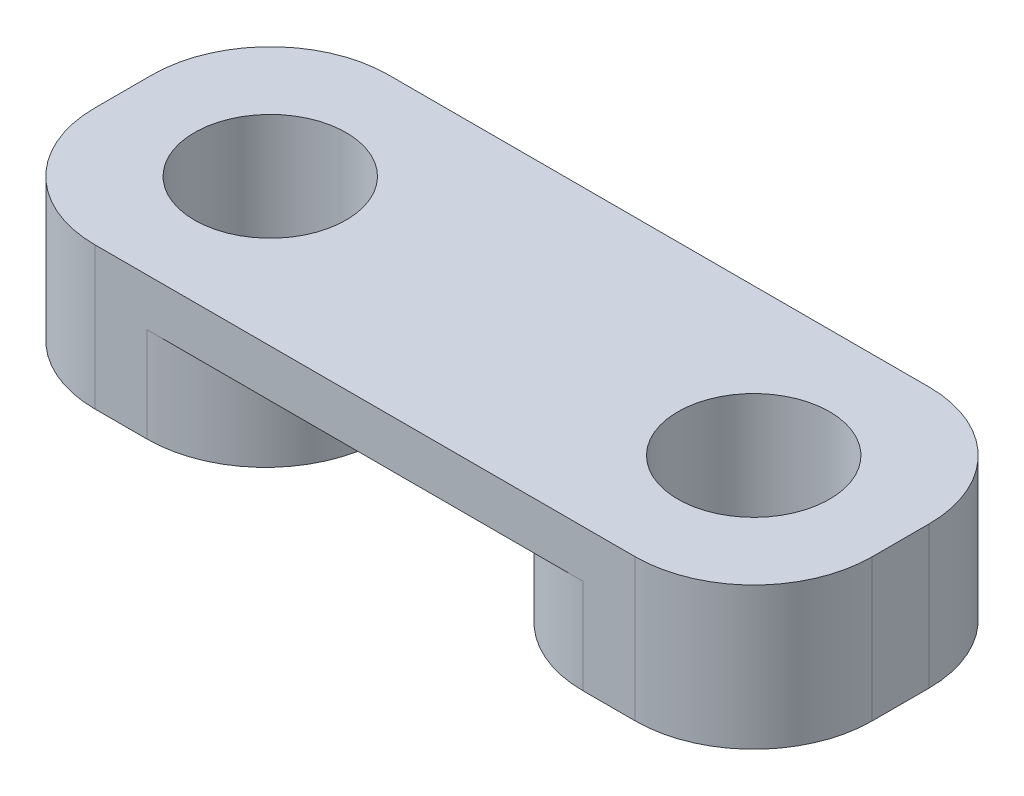
ISO-10303-21;
HEADER;
FILE_DESCRIPTION(('STEP AP214'),'2;1');
FILE_NAME('part.step','',(''),(''),'','','');
FILE_SCHEMA(('AUTOMOTIVE_DESIGN { 1 0 10303 214 1 1 1 1 }'));
ENDSEC;
DATA;
#1=APPLICATION_CONTEXT('core data for automotive mechanical design processes');
#2=APPLICATION_PROTOCOL_DEFINITION('international standard','automotive_design',2000,#1);
#3=PRODUCT_CONTEXT('',#1,'mechanical');
#4=PRODUCT('Part','Part','',(#3));
#5=PRODUCT_RELATED_PRODUCT_CATEGORY('part','',(#4));
#6=PRODUCT_DEFINITION_FORMATION('','',#4);
#7=PRODUCT_DEFINITION_CONTEXT('part definition',#1,'design');
#8=PRODUCT_DEFINITION('design','',#6,#7);
#9=PRODUCT_DEFINITION_SHAPE('','',#8);
#10=(LENGTH_UNIT() NAMED_UNIT(*) SI_UNIT(.MILLI.,.METRE.));
#11=(NAMED_UNIT(*) PLANE_ANGLE_UNIT() SI_UNIT($,.RADIAN.));
#12=(NAMED_UNIT(*) SI_UNIT($,.STERADIAN.) SOLID_ANGLE_UNIT());
#13=UNCERTAINTY_MEASURE_WITH_UNIT(LENGTH_MEASURE(1.E-05),#10,'distance_accuracy_value','');
#14=(GEOMETRIC_REPRESENTATION_CONTEXT(3) GLOBAL_UNCERTAINTY_ASSIGNED_CONTEXT((#13)) GLOBAL_UNIT_ASSIGNED_CONTEXT((#10,
#11,#12)) REPRESENTATION_CONTEXT('',''));
#15=CARTESIAN_POINT('',(0.,0.,0.));
#16=DIRECTION('',(0.,0.,1.));
#17=DIRECTION('',(1.,0.,0.));
#18=AXIS2_PLACEMENT_3D('',#15,#16,#17);
#19=CARTESIAN_POINT('',(0.,0.,0.));
#20=DIRECTION('',(0.,1.,0.));
#21=DIRECTION('',(0.,0.,1.));
#22=AXIS2_PLACEMENT_3D('',#19,#20,#21);
#23=PLANE('',#22);
#24=CARTESIAN_POINT('',(-5.0990195,0.,-3.1));
#25=DIRECTION('',(0.,1.,0.));
#26=DIRECTION('',(0.,0.,1.));
#27=AXIS2_PLACEMENT_3D('',#24,#25,#26);
#28=CIRCLE('',#27,1.6);
#29=CARTESIAN_POINT('',(-5.0990195,0.,-1.5));
#30=VERTEX_POINT('',#29);
#31=EDGE_CURVE('E284',#30,#30,#28,.T.);
#32=ORIENTED_EDGE('',*,*,#31,.T.);
#33=EDGE_LOOP('',(#32));
#34=FACE_BOUND('',#33,.T.);
#35=DIRECTION('',(-1.,0.,0.));
#36=VECTOR('',#35,1.);
#37=CARTESIAN_POINT('',(8.1990195,0.,-6.2));
#38=LINE('',#37,#36);
#39=CARTESIAN_POINT('',(-4.5990195,0.,-6.2));
#40=VERTEX_POINT('',#39);
#41=CARTESIAN_POINT('',(-5.6990195,0.,-6.2));
#42=VERTEX_POINT('',#41);
#43=EDGE_CURVE('E187',#40,#42,#38,.T.);
#44=ORIENTED_EDGE('',*,*,#43,.F.);
#45=CARTESIAN_POINT('',(-4.5990195,0.,-3.7));
#46=DIRECTION('',(0.,1.,0.));
#47=DIRECTION('',(0.,0.,1.));
#48=AXIS2_PLACEMENT_3D('',#45,#46,#47);
#49=CIRCLE('',#48,2.5);
#50=CARTESIAN_POINT('',(-2.0990195,0.,-3.7));
#51=VERTEX_POINT('',#50);
#52=EDGE_CURVE('E222',#40,#51,#49,.F.);
#53=ORIENTED_EDGE('',*,*,#52,.T.);
#54=DIRECTION('',(0.,0.,1.));
#55=VECTOR('',#54,1.);
#56=CARTESIAN_POINT('',(-2.0990195,0.,-6.2));
#57=LINE('',#56,#55);
#58=CARTESIAN_POINT('',(-2.0990195,0.,-2.5));
#59=VERTEX_POINT('',#58);
#60=EDGE_CURVE('E293',#51,#59,#57,.T.);
#61=ORIENTED_EDGE('',*,*,#60,.T.);
#62=CARTESIAN_POINT('',(-4.5990195,0.,-2.5));
#63=DIRECTION('',(0.,1.,0.));
#64=DIRECTION('',(0.,0.,1.));
#65=AXIS2_PLACEMENT_3D('',#62,#63,#64);
#66=CIRCLE('',#65,2.5);
#67=CARTESIAN_POINT('',(-4.5990195,0.,0.));
#68=VERTEX_POINT('',#67);
#69=EDGE_CURVE('E220',#59,#68,#66,.F.);
#70=ORIENTED_EDGE('',*,*,#69,.T.);
#71=DIRECTION('',(1.,0.,0.));
#72=VECTOR('',#71,1.);
#73=CARTESIAN_POINT('',(-8.1990195,0.,0.));
#74=LINE('',#73,#72);
#75=CARTESIAN_POINT('',(-5.6990195,0.,0.));
#76=VERTEX_POINT('',#75);
#77=EDGE_CURVE('E266',#76,#68,#74,.T.);
#78=ORIENTED_EDGE('',*,*,#77,.F.);
#79=CARTESIAN_POINT('',(-5.6990195,0.,-2.5));
#80=DIRECTION('',(0.,1.,0.));
#81=DIRECTION('',(0.,0.,1.));
#82=AXIS2_PLACEMENT_3D('',#79,#80,#81);
#83=CIRCLE('',#82,2.5);
#84=CARTESIAN_POINT('',(-8.1990195,0.,-2.5));
#85=VERTEX_POINT('',#84);
#86=EDGE_CURVE('E216',#76,#85,#83,.F.);
#87=ORIENTED_EDGE('',*,*,#86,.T.);
#88=DIRECTION('',(0.,0.,1.));
#89=VECTOR('',#88,1.);
#90=CARTESIAN_POINT('',(-8.1990195,0.,-6.2));
#91=LINE('',#90,#89);
#92=CARTESIAN_POINT('',(-8.1990195,0.,-3.7));
#93=VERTEX_POINT('',#92);
#94=EDGE_CURVE('E275',#93,#85,#91,.T.);
#95=ORIENTED_EDGE('',*,*,#94,.F.);
#96=CARTESIAN_POINT('',(-5.6990195,0.,-3.7));
#97=DIRECTION('',(0.,1.,0.));
#98=DIRECTION('',(0.,0.,1.));
#99=AXIS2_PLACEMENT_3D('',#96,#97,#98);
#100=CIRCLE('',#99,2.5);
#101=EDGE_CURVE('E218',#93,#42,#100,.F.);
#102=ORIENTED_EDGE('',*,*,#101,.T.);
#103=EDGE_LOOP('',(#44,#53,#61,#70,#78,#87,#95,#102));
#104=FACE_BOUND('',#103,.T.);
#105=ADVANCED_FACE('F39',(#34,#104),#23,.F.);
#106=CARTESIAN_POINT('',(0.,3.,0.));
#107=DIRECTION('',(0.,1.,0.));
#108=DIRECTION('',(0.,0.,1.));
#109=AXIS2_PLACEMENT_3D('',#106,#107,#108);
#110=PLANE('',#109);
#111=CARTESIAN_POINT('',(-5.0990195,3.,-3.1));
#112=DIRECTION('',(0.,1.,0.));
#113=DIRECTION('',(0.,0.,1.));
#114=AXIS2_PLACEMENT_3D('',#111,#112,#113);
#115=CIRCLE('',#114,1.6);
#116=CARTESIAN_POINT('',(-5.0990195,3.,-1.5));
#117=VERTEX_POINT('',#116);
#118=EDGE_CURVE('E276',#117,#117,#115,.T.);
#119=ORIENTED_EDGE('',*,*,#118,.F.);
#120=EDGE_LOOP('',(#119));
#121=FACE_BOUND('',#120,.T.);
#122=DIRECTION('',(0.,0.,-1.));
#123=VECTOR('',#122,1.);
#124=CARTESIAN_POINT('',(8.1990195,3.,0.));
#125=LINE('',#124,#123);
#126=CARTESIAN_POINT('',(8.1990195,3.,-2.5));
#127=VERTEX_POINT('',#126);
#128=CARTESIAN_POINT('',(8.1990195,3.,-3.7));
#129=VERTEX_POINT('',#128);
#130=EDGE_CURVE('E184',#127,#129,#125,.T.);
#131=ORIENTED_EDGE('',*,*,#130,.T.);
#132=CARTESIAN_POINT('',(5.6990195,3.,-3.7));
#133=DIRECTION('',(0.,1.,0.));
#134=DIRECTION('',(0.,0.,1.));
#135=AXIS2_PLACEMENT_3D('',#132,#133,#134);
#136=CIRCLE('',#135,2.5);
#137=CARTESIAN_POINT('',(5.6990195,3.,-6.2));
#138=VERTEX_POINT('',#137);
#139=EDGE_CURVE('E239',#129,#138,#136,.T.);
#140=ORIENTED_EDGE('',*,*,#139,.T.);
#141=DIRECTION('',(-1.,0.,0.));
#142=VECTOR('',#141,1.);
#143=CARTESIAN_POINT('',(8.1990195,3.,-6.2));
#144=LINE('',#143,#142);
#145=CARTESIAN_POINT('',(-5.6990195,3.,-6.2));
#146=VERTEX_POINT('',#145);
#147=EDGE_CURVE('E180',#138,#146,#144,.T.);
#148=ORIENTED_EDGE('',*,*,#147,.T.);
#149=CARTESIAN_POINT('',(-5.6990195,3.,-3.7));
#150=DIRECTION('',(0.,1.,0.));
#151=DIRECTION('',(0.,0.,1.));
#152=AXIS2_PLACEMENT_3D('',#149,#150,#151);
#153=CIRCLE('',#152,2.5);
#154=CARTESIAN_POINT('',(-8.1990195,3.,-3.7));
#155=VERTEX_POINT('',#154);
#156=EDGE_CURVE('E61',#146,#155,#153,.T.);
#157=ORIENTED_EDGE('',*,*,#156,.T.);
#158=DIRECTION('',(0.,0.,1.));
#159=VECTOR('',#158,1.);
#160=CARTESIAN_POINT('',(-8.1990195,3.,-6.2));
#161=LINE('',#160,#159);
#162=CARTESIAN_POINT('',(-8.1990195,3.,-2.5));
#163=VERTEX_POINT('',#162);
#164=EDGE_CURVE('E264',#155,#163,#161,.T.);
#165=ORIENTED_EDGE('',*,*,#164,.T.);
#166=CARTESIAN_POINT('',(-5.6990195,3.,-2.5));
#167=DIRECTION('',(0.,1.,0.));
#168=DIRECTION('',(0.,0.,1.));
#169=AXIS2_PLACEMENT_3D('',#166,#167,#168);
#170=CIRCLE('',#169,2.5);
#171=CARTESIAN_POINT('',(-5.6990195,3.,0.));
#172=VERTEX_POINT('',#171);
#173=EDGE_CURVE('E234',#163,#172,#170,.T.);
#174=ORIENTED_EDGE('',*,*,#173,.T.);
#175=DIRECTION('',(1.,0.,0.));
#176=VECTOR('',#175,1.);
#177=CARTESIAN_POINT('',(-8.1990195,3.,0.));
#178=LINE('',#177,#176);
#179=CARTESIAN_POINT('',(5.6990195,3.,0.));
#180=VERTEX_POINT('',#179);
#181=EDGE_CURVE('E280',#172,#180,#178,.T.);
#182=ORIENTED_EDGE('',*,*,#181,.T.);
#183=CARTESIAN_POINT('',(5.6990195,3.,-2.5));
#184=DIRECTION('',(0.,1.,0.));
#185=DIRECTION('',(0.,0.,1.));
#186=AXIS2_PLACEMENT_3D('',#183,#184,#185);
#187=CIRCLE('',#186,2.5);
#188=EDGE_CURVE('E237',#180,#127,#187,.T.);
#189=ORIENTED_EDGE('',*,*,#188,.T.);
#190=EDGE_LOOP('',(#131,#140,#148,#157,#165,#174,#182,#189));
#191=FACE_BOUND('',#190,.T.);
#192=CARTESIAN_POINT('',(5.0990195,3.,-3.1));
#193=DIRECTION('',(0.,1.,0.));
#194=DIRECTION('',(0.,0.,-1.));
#195=AXIS2_PLACEMENT_3D('',#192,#193,#194);
#196=CIRCLE('',#195,1.6);
#197=CARTESIAN_POINT('',(5.0990195,3.,-4.7));
#198=VERTEX_POINT('',#197);
#199=EDGE_CURVE('E287',#198,#198,#196,.T.);
#200=ORIENTED_EDGE('',*,*,#199,.F.);
#201=EDGE_LOOP('',(#200));
#202=FACE_BOUND('',#201,.T.);
#203=ADVANCED_FACE('F318',(#121,#191,#202),#110,.T.);
#204=CARTESIAN_POINT('',(4.5990195,0.,0.));
#205=VERTEX_POINT('',#204);
#206=CARTESIAN_POINT('',(5.6990195,0.,0.));
#207=VERTEX_POINT('',#206);
#208=EDGE_CURVE('E271',#205,#207,#74,.T.);
#209=ORIENTED_EDGE('',*,*,#208,.F.);
#210=CARTESIAN_POINT('',(4.5990195,0.,-2.5));
#211=DIRECTION('',(0.,1.,0.));
#212=DIRECTION('',(0.,0.,1.));
#213=AXIS2_PLACEMENT_3D('',#210,#211,#212);
#214=CIRCLE('',#213,2.5);
#215=CARTESIAN_POINT('',(2.0990195,0.,-2.5));
#216=VERTEX_POINT('',#215);
#217=EDGE_CURVE('E204',#205,#216,#214,.F.);
#218=ORIENTED_EDGE('',*,*,#217,.T.);
#219=DIRECTION('',(0.,0.,1.));
#220=VECTOR('',#219,1.);
#221=CARTESIAN_POINT('',(2.0990195,0.,-6.2));
#222=LINE('',#221,#220);
#223=CARTESIAN_POINT('',(2.0990195,0.,-3.7));
#224=VERTEX_POINT('',#223);
#225=EDGE_CURVE('E175',#224,#216,#222,.T.);
#226=ORIENTED_EDGE('',*,*,#225,.F.);
#227=CARTESIAN_POINT('',(4.5990195,0.,-3.7));
#228=DIRECTION('',(0.,1.,0.));
#229=DIRECTION('',(0.,0.,1.));
#230=AXIS2_PLACEMENT_3D('',#227,#228,#229);
#231=CIRCLE('',#230,2.5);
#232=CARTESIAN_POINT('',(4.5990195,0.,-6.2));
#233=VERTEX_POINT('',#232);
#234=EDGE_CURVE('E179',#224,#233,#231,.F.);
#235=ORIENTED_EDGE('',*,*,#234,.T.);
#236=CARTESIAN_POINT('',(5.6990195,0.,-6.2));
#237=VERTEX_POINT('',#236);
#238=EDGE_CURVE('E262',#237,#233,#38,.T.);
#239=ORIENTED_EDGE('',*,*,#238,.F.);
#240=CARTESIAN_POINT('',(5.6990195,0.,-3.7));
#241=DIRECTION('',(0.,1.,0.));
#242=DIRECTION('',(0.,0.,1.));
#243=AXIS2_PLACEMENT_3D('',#240,#241,#242);
#244=CIRCLE('',#243,2.5);
#245=CARTESIAN_POINT('',(8.1990195,0.,-3.7));
#246=VERTEX_POINT('',#245);
#247=EDGE_CURVE('E201',#237,#246,#244,.F.);
#248=ORIENTED_EDGE('',*,*,#247,.T.);
#249=DIRECTION('',(0.,0.,-1.));
#250=VECTOR('',#249,1.);
#251=CARTESIAN_POINT('',(8.1990195,0.,0.));
#252=LINE('',#251,#250);
#253=CARTESIAN_POINT('',(8.1990195,0.,-2.5));
#254=VERTEX_POINT('',#253);
#255=EDGE_CURVE('E263',#254,#246,#252,.T.);
#256=ORIENTED_EDGE('',*,*,#255,.F.);
#257=CARTESIAN_POINT('',(5.6990195,0.,-2.5));
#258=DIRECTION('',(0.,1.,0.));
#259=DIRECTION('',(0.,0.,1.));
#260=AXIS2_PLACEMENT_3D('',#257,#258,#259);
#261=CIRCLE('',#260,2.5);
#262=EDGE_CURVE('E199',#254,#207,#261,.F.);
#263=ORIENTED_EDGE('',*,*,#262,.T.);
#264=EDGE_LOOP('',(#209,#218,#226,#235,#239,#248,#256,#263));
#265=FACE_BOUND('',#264,.T.);
#266=CARTESIAN_POINT('',(5.0990195,0.,-3.1));
#267=DIRECTION('',(0.,1.,0.));
#268=DIRECTION('',(0.,0.,-1.));
#269=AXIS2_PLACEMENT_3D('',#266,#267,#268);
#270=CIRCLE('',#269,1.6);
#271=CARTESIAN_POINT('',(5.0990195,0.,-4.7));
#272=VERTEX_POINT('',#271);
#273=EDGE_CURVE('E290',#272,#272,#270,.T.);
#274=ORIENTED_EDGE('',*,*,#273,.T.);
#275=EDGE_LOOP('',(#274));
#276=FACE_BOUND('',#275,.T.);
#277=ADVANCED_FACE('F345',(#265,#276),#23,.F.);
#278=CARTESIAN_POINT('',(-8.1990195,3.,-6.2));
#279=DIRECTION('',(1.,0.,0.));
#280=DIRECTION('',(0.,0.,-1.));
#281=AXIS2_PLACEMENT_3D('',#278,#279,#280);
#282=PLANE('',#281);
#283=ORIENTED_EDGE('',*,*,#164,.F.);
#284=DIRECTION('',(0.,-1.,0.));
#285=VECTOR('',#284,1.);
#286=CARTESIAN_POINT('',(-8.1990195,3.,-3.7));
#287=LINE('',#286,#285);
#288=EDGE_CURVE('E242',#155,#93,#287,.T.);
#289=ORIENTED_EDGE('',*,*,#288,.T.);
#290=ORIENTED_EDGE('',*,*,#94,.T.);
#291=DIRECTION('',(0.,-1.,0.));
#292=VECTOR('',#291,1.);
#293=CARTESIAN_POINT('',(-8.1990195,3.,-2.5));
#294=LINE('',#293,#292);
#295=EDGE_CURVE('E54',#85,#163,#294,.F.);
#296=ORIENTED_EDGE('',*,*,#295,.T.);
#297=EDGE_LOOP('',(#283,#289,#290,#296));
#298=FACE_BOUND('',#297,.T.);
#299=ADVANCED_FACE('F314',(#298),#282,.F.);
#300=CARTESIAN_POINT('',(-8.1990195,3.,0.));
#301=DIRECTION('',(0.,0.,-1.));
#302=DIRECTION('',(-1.,0.,0.));
#303=AXIS2_PLACEMENT_3D('',#300,#301,#302);
#304=PLANE('',#303);
#305=DIRECTION('',(-1.,0.,0.));
#306=VECTOR('',#305,1.);
#307=CARTESIAN_POINT('',(-2.0990195,2.,0.));
#308=LINE('',#307,#306);
#309=CARTESIAN_POINT('',(4.5990195,2.,0.));
#310=VERTEX_POINT('',#309);
#311=CARTESIAN_POINT('',(-4.5990195,2.,0.));
#312=VERTEX_POINT('',#311);
#313=EDGE_CURVE('E299',#310,#312,#308,.T.);
#314=ORIENTED_EDGE('',*,*,#313,.F.);
#315=DIRECTION('',(0.,1.,0.));
#316=VECTOR('',#315,1.);
#317=CARTESIAN_POINT('',(4.5990195,3.,0.));
#318=LINE('',#317,#316);
#319=EDGE_CURVE('E197',#310,#205,#318,.F.);
#320=ORIENTED_EDGE('',*,*,#319,.T.);
#321=ORIENTED_EDGE('',*,*,#208,.T.);
#322=DIRECTION('',(0.,-1.,0.));
#323=VECTOR('',#322,1.);
#324=CARTESIAN_POINT('',(5.6990195,3.,0.));
#325=LINE('',#324,#323);
#326=EDGE_CURVE('E192',#207,#180,#325,.F.);
#327=ORIENTED_EDGE('',*,*,#326,.T.);
#328=ORIENTED_EDGE('',*,*,#181,.F.);
#329=DIRECTION('',(0.,-1.,0.));
#330=VECTOR('',#329,1.);
#331=CARTESIAN_POINT('',(-5.6990195,3.,0.));
#332=LINE('',#331,#330);
#333=EDGE_CURVE('E182',#172,#76,#332,.T.);
#334=ORIENTED_EDGE('',*,*,#333,.T.);
#335=ORIENTED_EDGE('',*,*,#77,.T.);
#336=DIRECTION('',(0.,-1.,0.));
#337=VECTOR('',#336,1.);
#338=CARTESIAN_POINT('',(-4.5990195,3.,0.));
#339=LINE('',#338,#337);
#340=EDGE_CURVE('E194',#68,#312,#339,.F.);
#341=ORIENTED_EDGE('',*,*,#340,.T.);
#342=EDGE_LOOP('',(#314,#320,#321,#327,#328,#334,#335,#341));
#343=FACE_BOUND('',#342,.T.);
#344=ADVANCED_FACE('F305',(#343),#304,.F.);
#345=CARTESIAN_POINT('',(8.1990195,3.,0.));
#346=DIRECTION('',(-1.,0.,0.));
#347=DIRECTION('',(0.,0.,1.));
#348=AXIS2_PLACEMENT_3D('',#345,#346,#347);
#349=PLANE('',#348);
#350=ORIENTED_EDGE('',*,*,#255,.T.);
#351=DIRECTION('',(0.,-1.,0.));
#352=VECTOR('',#351,1.);
#353=CARTESIAN_POINT('',(8.1990195,3.,-3.7));
#354=LINE('',#353,#352);
#355=EDGE_CURVE('E232',#246,#129,#354,.F.);
#356=ORIENTED_EDGE('',*,*,#355,.T.);
#357=ORIENTED_EDGE('',*,*,#130,.F.);
#358=DIRECTION('',(0.,-1.,0.));
#359=VECTOR('',#358,1.);
#360=CARTESIAN_POINT('',(8.1990195,3.,-2.5));
#361=LINE('',#360,#359);
#362=EDGE_CURVE('E229',#127,#254,#361,.T.);
#363=ORIENTED_EDGE('',*,*,#362,.T.);
#364=EDGE_LOOP('',(#350,#356,#357,#363));
#365=FACE_BOUND('',#364,.T.);
#366=ADVANCED_FACE('F328',(#365),#349,.F.);
#367=CARTESIAN_POINT('',(8.1990195,3.,-6.2));
#368=DIRECTION('',(0.,0.,1.));
#369=DIRECTION('',(1.,0.,0.));
#370=AXIS2_PLACEMENT_3D('',#367,#368,#369);
#371=PLANE('',#370);
#372=ORIENTED_EDGE('',*,*,#238,.T.);
#373=DIRECTION('',(0.,1.,0.));
#374=VECTOR('',#373,1.);
#375=CARTESIAN_POINT('',(4.5990195,3.,-6.2));
#376=LINE('',#375,#374);
#377=CARTESIAN_POINT('',(4.5990195,2.,-6.2));
#378=VERTEX_POINT('',#377);
#379=EDGE_CURVE('E214',#233,#378,#376,.T.);
#380=ORIENTED_EDGE('',*,*,#379,.T.);
#381=DIRECTION('',(-1.,0.,0.));
#382=VECTOR('',#381,1.);
#383=CARTESIAN_POINT('',(-2.0990195,2.,-6.2));
#384=LINE('',#383,#382);
#385=CARTESIAN_POINT('',(-4.5990195,2.,-6.2));
#386=VERTEX_POINT('',#385);
#387=EDGE_CURVE('E159',#378,#386,#384,.T.);
#388=ORIENTED_EDGE('',*,*,#387,.T.);
#389=DIRECTION('',(0.,-1.,0.));
#390=VECTOR('',#389,1.);
#391=CARTESIAN_POINT('',(-4.5990195,3.,-6.2));
#392=LINE('',#391,#390);
#393=EDGE_CURVE('E211',#386,#40,#392,.T.);
#394=ORIENTED_EDGE('',*,*,#393,.T.);
#395=ORIENTED_EDGE('',*,*,#43,.T.);
#396=DIRECTION('',(0.,-1.,0.));
#397=VECTOR('',#396,1.);
#398=CARTESIAN_POINT('',(-5.6990195,3.,-6.2));
#399=LINE('',#398,#397);
#400=EDGE_CURVE('E206',#42,#146,#399,.F.);
#401=ORIENTED_EDGE('',*,*,#400,.T.);
#402=ORIENTED_EDGE('',*,*,#147,.F.);
#403=DIRECTION('',(0.,-1.,0.));
#404=VECTOR('',#403,1.);
#405=CARTESIAN_POINT('',(5.6990195,3.,-6.2));
#406=LINE('',#405,#404);
#407=EDGE_CURVE('E208',#138,#237,#406,.T.);
#408=ORIENTED_EDGE('',*,*,#407,.T.);
#409=EDGE_LOOP('',(#372,#380,#388,#394,#395,#401,#402,#408));
#410=FACE_BOUND('',#409,.T.);
#411=ADVANCED_FACE('F256',(#410),#371,.F.);
#412=CARTESIAN_POINT('',(-5.0990195,3.,-3.1));
#413=DIRECTION('',(0.,-1.,0.));
#414=DIRECTION('',(0.,0.,-1.));
#415=AXIS2_PLACEMENT_3D('',#412,#413,#414);
#416=CYLINDRICAL_SURFACE('',#415,1.6);
#417=ORIENTED_EDGE('',*,*,#118,.T.);
#418=EDGE_LOOP('',(#417));
#419=FACE_BOUND('',#418,.T.);
#420=ORIENTED_EDGE('',*,*,#31,.F.);
#421=EDGE_LOOP('',(#420));
#422=FACE_BOUND('',#421,.T.);
#423=ADVANCED_FACE('F364',(#419,#422),#416,.F.);
#424=CARTESIAN_POINT('',(5.0990195,3.,-3.1));
#425=DIRECTION('',(0.,-1.,0.));
#426=DIRECTION('',(0.,0.,-1.));
#427=AXIS2_PLACEMENT_3D('',#424,#425,#426);
#428=CYLINDRICAL_SURFACE('',#427,1.6);
#429=ORIENTED_EDGE('',*,*,#199,.T.);
#430=EDGE_LOOP('',(#429));
#431=FACE_BOUND('',#430,.T.);
#432=ORIENTED_EDGE('',*,*,#273,.F.);
#433=EDGE_LOOP('',(#432));
#434=FACE_BOUND('',#433,.T.);
#435=ADVANCED_FACE('F362',(#431,#434),#428,.F.);
#436=CARTESIAN_POINT('',(-2.0990195,0.,-6.2));
#437=DIRECTION('',(-1.,0.,0.));
#438=DIRECTION('',(0.,-1.,0.));
#439=AXIS2_PLACEMENT_3D('',#436,#437,#438);
#440=PLANE('',#439);
#441=ORIENTED_EDGE('',*,*,#60,.F.);
#442=DIRECTION('',(0.,-1.,0.));
#443=VECTOR('',#442,1.);
#444=CARTESIAN_POINT('',(-2.0990195,0.,-3.7));
#445=LINE('',#444,#443);
#446=CARTESIAN_POINT('',(-2.0990195,2.,-3.7));
#447=VERTEX_POINT('',#446);
#448=EDGE_CURVE('E227',#51,#447,#445,.F.);
#449=ORIENTED_EDGE('',*,*,#448,.T.);
#450=DIRECTION('',(0.,0.,1.));
#451=VECTOR('',#450,1.);
#452=CARTESIAN_POINT('',(-2.0990195,2.,-6.2));
#453=LINE('',#452,#451);
#454=CARTESIAN_POINT('',(-2.0990195,2.,-2.5));
#455=VERTEX_POINT('',#454);
#456=EDGE_CURVE('E174',#447,#455,#453,.T.);
#457=ORIENTED_EDGE('',*,*,#456,.T.);
#458=DIRECTION('',(0.,-1.,0.));
#459=VECTOR('',#458,1.);
#460=CARTESIAN_POINT('',(-2.0990195,0.,-2.5));
#461=LINE('',#460,#459);
#462=EDGE_CURVE('E224',#455,#59,#461,.T.);
#463=ORIENTED_EDGE('',*,*,#462,.T.);
#464=EDGE_LOOP('',(#441,#449,#457,#463));
#465=FACE_BOUND('',#464,.T.);
#466=ADVANCED_FACE('F311',(#465),#440,.F.);
#467=CARTESIAN_POINT('',(-2.0990195,2.,-6.2));
#468=DIRECTION('',(0.,1.,0.));
#469=DIRECTION('',(-1.,0.,0.));
#470=AXIS2_PLACEMENT_3D('',#467,#468,#469);
#471=PLANE('',#470);
#472=ORIENTED_EDGE('',*,*,#313,.T.);
#473=CARTESIAN_POINT('',(-4.5990195,2.,-2.5));
#474=DIRECTION('',(0.,1.,0.));
#475=DIRECTION('',(-1.,0.,0.));
#476=AXIS2_PLACEMENT_3D('',#473,#474,#475);
#477=CIRCLE('',#476,2.5);
#478=EDGE_CURVE('E11',#312,#455,#477,.T.);
#479=ORIENTED_EDGE('',*,*,#478,.T.);
#480=ORIENTED_EDGE('',*,*,#456,.F.);
#481=CARTESIAN_POINT('',(-4.5990195,2.,-3.7));
#482=DIRECTION('',(0.,1.,0.));
#483=DIRECTION('',(-1.,0.,0.));
#484=AXIS2_PLACEMENT_3D('',#481,#482,#483);
#485=CIRCLE('',#484,2.5);
#486=EDGE_CURVE('E47',#447,#386,#485,.T.);
#487=ORIENTED_EDGE('',*,*,#486,.T.);
#488=ORIENTED_EDGE('',*,*,#387,.F.);
#489=CARTESIAN_POINT('',(4.5990195,2.,-3.7));
#490=DIRECTION('',(0.,1.,0.));
#491=DIRECTION('',(-1.,0.,0.));
#492=AXIS2_PLACEMENT_3D('',#489,#490,#491);
#493=CIRCLE('',#492,2.5);
#494=CARTESIAN_POINT('',(2.0990195,2.,-3.7));
#495=VERTEX_POINT('',#494);
#496=EDGE_CURVE('E153',#378,#495,#493,.T.);
#497=ORIENTED_EDGE('',*,*,#496,.T.);
#498=DIRECTION('',(0.,0.,1.));
#499=VECTOR('',#498,1.);
#500=CARTESIAN_POINT('',(2.0990195,2.,-6.2));
#501=LINE('',#500,#499);
#502=CARTESIAN_POINT('',(2.0990195,2.,-2.5));
#503=VERTEX_POINT('',#502);
#504=EDGE_CURVE('E157',#495,#503,#501,.T.);
#505=ORIENTED_EDGE('',*,*,#504,.T.);
#506=CARTESIAN_POINT('',(4.5990195,2.,-2.5));
#507=DIRECTION('',(0.,1.,0.));
#508=DIRECTION('',(-1.,0.,0.));
#509=AXIS2_PLACEMENT_3D('',#506,#507,#508);
#510=CIRCLE('',#509,2.5);
#511=EDGE_CURVE('E164',#503,#310,#510,.T.);
#512=ORIENTED_EDGE('',*,*,#511,.T.);
#513=EDGE_LOOP('',(#472,#479,#480,#487,#488,#497,#505,#512));
#514=FACE_BOUND('',#513,.T.);
#515=ADVANCED_FACE('F155',(#514),#471,.F.);
#516=CARTESIAN_POINT('',(2.0990195,2.,-6.2));
#517=DIRECTION('',(1.,0.,0.));
#518=DIRECTION('',(0.,1.,0.));
#519=AXIS2_PLACEMENT_3D('',#516,#517,#518);
#520=PLANE('',#519);
#521=ORIENTED_EDGE('',*,*,#225,.T.);
#522=DIRECTION('',(0.,1.,0.));
#523=VECTOR('',#522,1.);
#524=CARTESIAN_POINT('',(2.0990195,2.,-2.5));
#525=LINE('',#524,#523);
#526=EDGE_CURVE('E173',#216,#503,#525,.T.);
#527=ORIENTED_EDGE('',*,*,#526,.T.);
#528=ORIENTED_EDGE('',*,*,#504,.F.);
#529=DIRECTION('',(0.,1.,0.));
#530=VECTOR('',#529,1.);
#531=CARTESIAN_POINT('',(2.0990195,2.,-3.7));
#532=LINE('',#531,#530);
#533=EDGE_CURVE('E170',#495,#224,#532,.F.);
#534=ORIENTED_EDGE('',*,*,#533,.T.);
#535=EDGE_LOOP('',(#521,#527,#528,#534));
#536=FACE_BOUND('',#535,.T.);
#537=ADVANCED_FACE('F169',(#536),#520,.F.);
#538=CARTESIAN_POINT('',(4.5990195,2.,-2.5));
#539=DIRECTION('',(0.,1.,0.));
#540=DIRECTION('',(-1.,0.,0.));
#541=AXIS2_PLACEMENT_3D('',#538,#539,#540);
#542=CYLINDRICAL_SURFACE('',#541,2.5);
#543=ORIENTED_EDGE('',*,*,#217,.F.);
#544=ORIENTED_EDGE('',*,*,#319,.F.);
#545=ORIENTED_EDGE('',*,*,#511,.F.);
#546=ORIENTED_EDGE('',*,*,#526,.F.);
#547=EDGE_LOOP('',(#543,#544,#545,#546));
#548=FACE_BOUND('',#547,.T.);
#549=ADVANCED_FACE('F377',(#548),#542,.T.);
#550=CARTESIAN_POINT('',(4.5990195,3.,-3.7));
#551=DIRECTION('',(0.,1.,0.));
#552=DIRECTION('',(-1.,0.,0.));
#553=AXIS2_PLACEMENT_3D('',#550,#551,#552);
#554=CYLINDRICAL_SURFACE('',#553,2.5);
#555=ORIENTED_EDGE('',*,*,#234,.F.);
#556=ORIENTED_EDGE('',*,*,#533,.F.);
#557=ORIENTED_EDGE('',*,*,#496,.F.);
#558=ORIENTED_EDGE('',*,*,#379,.F.);
#559=EDGE_LOOP('',(#555,#556,#557,#558));
#560=FACE_BOUND('',#559,.T.);
#561=ADVANCED_FACE('F178',(#560),#554,.T.);
#562=CARTESIAN_POINT('',(-4.5990195,3.,-3.7));
#563=DIRECTION('',(0.,-1.,0.));
#564=DIRECTION('',(1.,0.,0.));
#565=AXIS2_PLACEMENT_3D('',#562,#563,#564);
#566=CYLINDRICAL_SURFACE('',#565,2.5);
#567=ORIENTED_EDGE('',*,*,#486,.F.);
#568=ORIENTED_EDGE('',*,*,#448,.F.);
#569=ORIENTED_EDGE('',*,*,#52,.F.);
#570=ORIENTED_EDGE('',*,*,#393,.F.);
#571=EDGE_LOOP('',(#567,#568,#569,#570));
#572=FACE_BOUND('',#571,.T.);
#573=ADVANCED_FACE('F251',(#572),#566,.T.);
#574=CARTESIAN_POINT('',(-4.5990195,0.,-2.5));
#575=DIRECTION('',(0.,-1.,0.));
#576=DIRECTION('',(1.,0.,0.));
#577=AXIS2_PLACEMENT_3D('',#574,#575,#576);
#578=CYLINDRICAL_SURFACE('',#577,2.5);
#579=ORIENTED_EDGE('',*,*,#478,.F.);
#580=ORIENTED_EDGE('',*,*,#340,.F.);
#581=ORIENTED_EDGE('',*,*,#69,.F.);
#582=ORIENTED_EDGE('',*,*,#462,.F.);
#583=EDGE_LOOP('',(#579,#580,#581,#582));
#584=FACE_BOUND('',#583,.T.);
#585=ADVANCED_FACE('F309',(#584),#578,.T.);
#586=CARTESIAN_POINT('',(5.6990195,3.,-3.7));
#587=DIRECTION('',(0.,-1.,0.));
#588=DIRECTION('',(0.,0.,-1.));
#589=AXIS2_PLACEMENT_3D('',#586,#587,#588);
#590=CYLINDRICAL_SURFACE('',#589,2.5);
#591=ORIENTED_EDGE('',*,*,#139,.F.);
#592=ORIENTED_EDGE('',*,*,#355,.F.);
#593=ORIENTED_EDGE('',*,*,#247,.F.);
#594=ORIENTED_EDGE('',*,*,#407,.F.);
#595=EDGE_LOOP('',(#591,#592,#593,#594));
#596=FACE_BOUND('',#595,.T.);
#597=ADVANCED_FACE('F330',(#596),#590,.T.);
#598=CARTESIAN_POINT('',(5.6990195,3.,-2.5));
#599=DIRECTION('',(0.,-1.,0.));
#600=DIRECTION('',(0.,0.,-1.));
#601=AXIS2_PLACEMENT_3D('',#598,#599,#600);
#602=CYLINDRICAL_SURFACE('',#601,2.5);
#603=ORIENTED_EDGE('',*,*,#188,.F.);
#604=ORIENTED_EDGE('',*,*,#326,.F.);
#605=ORIENTED_EDGE('',*,*,#262,.F.);
#606=ORIENTED_EDGE('',*,*,#362,.F.);
#607=EDGE_LOOP('',(#603,#604,#605,#606));
#608=FACE_BOUND('',#607,.T.);
#609=ADVANCED_FACE('F324',(#608),#602,.T.);
#610=CARTESIAN_POINT('',(-5.6990195,3.,-3.7));
#611=DIRECTION('',(0.,-1.,0.));
#612=DIRECTION('',(0.,0.,-1.));
#613=AXIS2_PLACEMENT_3D('',#610,#611,#612);
#614=CYLINDRICAL_SURFACE('',#613,2.5);
#615=ORIENTED_EDGE('',*,*,#156,.F.);
#616=ORIENTED_EDGE('',*,*,#400,.F.);
#617=ORIENTED_EDGE('',*,*,#101,.F.);
#618=ORIENTED_EDGE('',*,*,#288,.F.);
#619=EDGE_LOOP('',(#615,#616,#617,#618));
#620=FACE_BOUND('',#619,.T.);
#621=ADVANCED_FACE('F335',(#620),#614,.T.);
#622=CARTESIAN_POINT('',(-5.6990195,3.,-2.5));
#623=DIRECTION('',(0.,-1.,0.));
#624=DIRECTION('',(0.,0.,-1.));
#625=AXIS2_PLACEMENT_3D('',#622,#623,#624);
#626=CYLINDRICAL_SURFACE('',#625,2.5);
#627=ORIENTED_EDGE('',*,*,#173,.F.);
#628=ORIENTED_EDGE('',*,*,#295,.F.);
#629=ORIENTED_EDGE('',*,*,#86,.F.);
#630=ORIENTED_EDGE('',*,*,#333,.F.);
#631=EDGE_LOOP('',(#627,#628,#629,#630));
#632=FACE_BOUND('',#631,.T.);
#633=ADVANCED_FACE('F41',(#632),#626,.T.);
#634=CLOSED_SHELL('',(#105,#203,#277,#299,#344,#366,#411,#423,#435,#466,#515,#537,#549,#561,
#573,#585,#597,#609,#621,#633));
#635=MANIFOLD_SOLID_BREP('B2',#634);
#636=ADVANCED_BREP_SHAPE_REPRESENTATION('',(#18,#635),#14);
#637=SHAPE_DEFINITION_REPRESENTATION(#9,#636);
ENDSEC;
END-ISO-10303-21;
